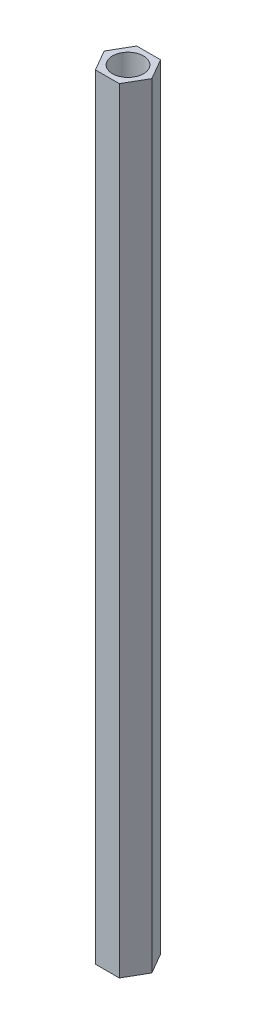
ISO-10303-21;
HEADER;
FILE_DESCRIPTION(('STEP AP214'),'2;1');
FILE_NAME('part.step','',(''),(''),'','','');
FILE_SCHEMA(('AUTOMOTIVE_DESIGN { 1 0 10303 214 1 1 1 1 }'));
ENDSEC;
DATA;
#1=APPLICATION_CONTEXT('core data for automotive mechanical design processes');
#2=APPLICATION_PROTOCOL_DEFINITION('international standard','automotive_design',2000,#1);
#3=PRODUCT_CONTEXT('',#1,'mechanical');
#4=PRODUCT('Part','Part','',(#3));
#5=PRODUCT_RELATED_PRODUCT_CATEGORY('part','',(#4));
#6=PRODUCT_DEFINITION_FORMATION('','',#4);
#7=PRODUCT_DEFINITION_CONTEXT('part definition',#1,'design');
#8=PRODUCT_DEFINITION('design','',#6,#7);
#9=PRODUCT_DEFINITION_SHAPE('','',#8);
#10=(LENGTH_UNIT() NAMED_UNIT(*) SI_UNIT(.MILLI.,.METRE.));
#11=(NAMED_UNIT(*) PLANE_ANGLE_UNIT() SI_UNIT($,.RADIAN.));
#12=(NAMED_UNIT(*) SI_UNIT($,.STERADIAN.) SOLID_ANGLE_UNIT());
#13=UNCERTAINTY_MEASURE_WITH_UNIT(LENGTH_MEASURE(1.E-05),#10,'distance_accuracy_value','');
#14=(GEOMETRIC_REPRESENTATION_CONTEXT(3) GLOBAL_UNCERTAINTY_ASSIGNED_CONTEXT((#13)) GLOBAL_UNIT_ASSIGNED_CONTEXT((#10,
#11,#12)) REPRESENTATION_CONTEXT('',''));
#15=CARTESIAN_POINT('',(0.,0.,0.));
#16=DIRECTION('',(0.,0.,1.));
#17=DIRECTION('',(1.,0.,0.));
#18=AXIS2_PLACEMENT_3D('',#15,#16,#17);
#19=CARTESIAN_POINT('',(1.15470053837925,75.,2.));
#20=DIRECTION('',(-0.866025403784439,0.,-0.5));
#21=DIRECTION('',(-0.5,0.,0.866025403784439));
#22=AXIS2_PLACEMENT_3D('',#19,#20,#21);
#23=PLANE('',#22);
#24=DIRECTION('',(0.5,0.,-0.866025403784439));
#25=VECTOR('',#24,1.);
#26=CARTESIAN_POINT('',(1.15470053837925,0.,2.));
#27=LINE('',#26,#25);
#28=CARTESIAN_POINT('',(1.15470053837925,0.,2.));
#29=VERTEX_POINT('',#28);
#30=CARTESIAN_POINT('',(2.3094010767585,0.,0.));
#31=VERTEX_POINT('',#30);
#32=EDGE_CURVE('E134',#29,#31,#27,.T.);
#33=ORIENTED_EDGE('',*,*,#32,.T.);
#34=DIRECTION('',(0.,-1.,0.));
#35=VECTOR('',#34,1.);
#36=CARTESIAN_POINT('',(2.3094010767585,75.,0.));
#37=LINE('',#36,#35);
#38=CARTESIAN_POINT('',(2.3094010767585,75.,0.));
#39=VERTEX_POINT('',#38);
#40=EDGE_CURVE('E11',#39,#31,#37,.T.);
#41=ORIENTED_EDGE('',*,*,#40,.F.);
#42=DIRECTION('',(0.5,0.,-0.866025403784439));
#43=VECTOR('',#42,1.);
#44=CARTESIAN_POINT('',(1.15470053837925,75.,2.));
#45=LINE('',#44,#43);
#46=CARTESIAN_POINT('',(1.15470053837925,75.,2.));
#47=VERTEX_POINT('',#46);
#48=EDGE_CURVE('E151',#47,#39,#45,.T.);
#49=ORIENTED_EDGE('',*,*,#48,.F.);
#50=DIRECTION('',(0.,-1.,0.));
#51=VECTOR('',#50,1.);
#52=CARTESIAN_POINT('',(1.15470053837925,75.,2.));
#53=LINE('',#52,#51);
#54=EDGE_CURVE('E130',#47,#29,#53,.T.);
#55=ORIENTED_EDGE('',*,*,#54,.T.);
#56=EDGE_LOOP('',(#33,#41,#49,#55));
#57=FACE_BOUND('',#56,.T.);
#58=ADVANCED_FACE('F45',(#57),#23,.F.);
#59=CARTESIAN_POINT('',(2.3094010767585,75.,0.));
#60=DIRECTION('',(-0.866025403784438,0.,0.5));
#61=DIRECTION('',(0.5,0.,0.866025403784439));
#62=AXIS2_PLACEMENT_3D('',#59,#60,#61);
#63=PLANE('',#62);
#64=DIRECTION('',(-0.5,0.,-0.866025403784438));
#65=VECTOR('',#64,1.);
#66=CARTESIAN_POINT('',(2.3094010767585,0.,0.));
#67=LINE('',#66,#65);
#68=CARTESIAN_POINT('',(1.15470053837925,0.,-2.));
#69=VERTEX_POINT('',#68);
#70=EDGE_CURVE('E138',#31,#69,#67,.T.);
#71=ORIENTED_EDGE('',*,*,#70,.T.);
#72=DIRECTION('',(0.,-1.,0.));
#73=VECTOR('',#72,1.);
#74=CARTESIAN_POINT('',(1.15470053837925,75.,-2.));
#75=LINE('',#74,#73);
#76=CARTESIAN_POINT('',(1.15470053837925,75.,-2.));
#77=VERTEX_POINT('',#76);
#78=EDGE_CURVE('E54',#77,#69,#75,.T.);
#79=ORIENTED_EDGE('',*,*,#78,.F.);
#80=DIRECTION('',(-0.5,0.,-0.866025403784438));
#81=VECTOR('',#80,1.);
#82=CARTESIAN_POINT('',(2.3094010767585,75.,0.));
#83=LINE('',#82,#81);
#84=EDGE_CURVE('E99',#39,#77,#83,.T.);
#85=ORIENTED_EDGE('',*,*,#84,.F.);
#86=ORIENTED_EDGE('',*,*,#40,.T.);
#87=EDGE_LOOP('',(#71,#79,#85,#86));
#88=FACE_BOUND('',#87,.T.);
#89=ADVANCED_FACE('F180',(#88),#63,.F.);
#90=CARTESIAN_POINT('',(1.15470053837925,75.,-2.));
#91=DIRECTION('',(0.,0.,1.));
#92=DIRECTION('',(1.,0.,0.));
#93=AXIS2_PLACEMENT_3D('',#90,#91,#92);
#94=PLANE('',#93);
#95=DIRECTION('',(-1.,0.,0.));
#96=VECTOR('',#95,1.);
#97=CARTESIAN_POINT('',(1.15470053837925,0.,-2.));
#98=LINE('',#97,#96);
#99=CARTESIAN_POINT('',(-1.15470053837925,0.,-2.));
#100=VERTEX_POINT('',#99);
#101=EDGE_CURVE('E142',#69,#100,#98,.T.);
#102=ORIENTED_EDGE('',*,*,#101,.T.);
#103=DIRECTION('',(0.,-1.,0.));
#104=VECTOR('',#103,1.);
#105=CARTESIAN_POINT('',(-1.15470053837925,75.,-2.));
#106=LINE('',#105,#104);
#107=CARTESIAN_POINT('',(-1.15470053837925,75.,-2.));
#108=VERTEX_POINT('',#107);
#109=EDGE_CURVE('E123',#108,#100,#106,.T.);
#110=ORIENTED_EDGE('',*,*,#109,.F.);
#111=DIRECTION('',(-1.,0.,0.));
#112=VECTOR('',#111,1.);
#113=CARTESIAN_POINT('',(1.15470053837925,75.,-2.));
#114=LINE('',#113,#112);
#115=EDGE_CURVE('E112',#77,#108,#114,.T.);
#116=ORIENTED_EDGE('',*,*,#115,.F.);
#117=ORIENTED_EDGE('',*,*,#78,.T.);
#118=EDGE_LOOP('',(#102,#110,#116,#117));
#119=FACE_BOUND('',#118,.T.);
#120=ADVANCED_FACE('F161',(#119),#94,.F.);
#121=CARTESIAN_POINT('',(-1.15470053837925,75.,-2.));
#122=DIRECTION('',(0.866025403784439,0.,0.5));
#123=DIRECTION('',(0.5,0.,-0.866025403784439));
#124=AXIS2_PLACEMENT_3D('',#121,#122,#123);
#125=PLANE('',#124);
#126=DIRECTION('',(-0.5,0.,0.866025403784439));
#127=VECTOR('',#126,1.);
#128=CARTESIAN_POINT('',(-1.15470053837925,0.,-2.));
#129=LINE('',#128,#127);
#130=CARTESIAN_POINT('',(-2.3094010767585,0.,0.));
#131=VERTEX_POINT('',#130);
#132=EDGE_CURVE('E121',#100,#131,#129,.T.);
#133=ORIENTED_EDGE('',*,*,#132,.T.);
#134=DIRECTION('',(0.,-1.,0.));
#135=VECTOR('',#134,1.);
#136=CARTESIAN_POINT('',(-2.3094010767585,75.,0.));
#137=LINE('',#136,#135);
#138=CARTESIAN_POINT('',(-2.3094010767585,75.,0.));
#139=VERTEX_POINT('',#138);
#140=EDGE_CURVE('E118',#139,#131,#137,.T.);
#141=ORIENTED_EDGE('',*,*,#140,.F.);
#142=DIRECTION('',(-0.5,0.,0.866025403784439));
#143=VECTOR('',#142,1.);
#144=CARTESIAN_POINT('',(-1.15470053837925,75.,-2.));
#145=LINE('',#144,#143);
#146=EDGE_CURVE('E106',#108,#139,#145,.T.);
#147=ORIENTED_EDGE('',*,*,#146,.F.);
#148=ORIENTED_EDGE('',*,*,#109,.T.);
#149=EDGE_LOOP('',(#133,#141,#147,#148));
#150=FACE_BOUND('',#149,.T.);
#151=ADVANCED_FACE('F119',(#150),#125,.F.);
#152=CARTESIAN_POINT('',(-2.3094010767585,75.,0.));
#153=DIRECTION('',(0.866025403784439,0.,-0.5));
#154=DIRECTION('',(-0.5,0.,-0.866025403784439));
#155=AXIS2_PLACEMENT_3D('',#152,#153,#154);
#156=PLANE('',#155);
#157=DIRECTION('',(0.5,0.,0.866025403784439));
#158=VECTOR('',#157,1.);
#159=CARTESIAN_POINT('',(-2.3094010767585,0.,0.));
#160=LINE('',#159,#158);
#161=CARTESIAN_POINT('',(-1.15470053837925,0.,2.));
#162=VERTEX_POINT('',#161);
#163=EDGE_CURVE('E85',#131,#162,#160,.T.);
#164=ORIENTED_EDGE('',*,*,#163,.T.);
#165=DIRECTION('',(0.,-1.,0.));
#166=VECTOR('',#165,1.);
#167=CARTESIAN_POINT('',(-1.15470053837925,75.,2.));
#168=LINE('',#167,#166);
#169=CARTESIAN_POINT('',(-1.15470053837925,75.,2.));
#170=VERTEX_POINT('',#169);
#171=EDGE_CURVE('E124',#170,#162,#168,.T.);
#172=ORIENTED_EDGE('',*,*,#171,.F.);
#173=DIRECTION('',(0.5,0.,0.866025403784439));
#174=VECTOR('',#173,1.);
#175=CARTESIAN_POINT('',(-2.3094010767585,75.,0.));
#176=LINE('',#175,#174);
#177=EDGE_CURVE('E110',#139,#170,#176,.T.);
#178=ORIENTED_EDGE('',*,*,#177,.F.);
#179=ORIENTED_EDGE('',*,*,#140,.T.);
#180=EDGE_LOOP('',(#164,#172,#178,#179));
#181=FACE_BOUND('',#180,.T.);
#182=ADVANCED_FACE('F126',(#181),#156,.F.);
#183=CARTESIAN_POINT('',(-1.15470053837925,75.,2.));
#184=DIRECTION('',(0.,0.,-1.));
#185=DIRECTION('',(-1.,0.,0.));
#186=AXIS2_PLACEMENT_3D('',#183,#184,#185);
#187=PLANE('',#186);
#188=DIRECTION('',(1.,0.,0.));
#189=VECTOR('',#188,1.);
#190=CARTESIAN_POINT('',(-1.15470053837925,0.,2.));
#191=LINE('',#190,#189);
#192=EDGE_CURVE('E91',#162,#29,#191,.T.);
#193=ORIENTED_EDGE('',*,*,#192,.T.);
#194=ORIENTED_EDGE('',*,*,#54,.F.);
#195=DIRECTION('',(1.,0.,0.));
#196=VECTOR('',#195,1.);
#197=CARTESIAN_POINT('',(-1.15470053837925,75.,2.));
#198=LINE('',#197,#196);
#199=EDGE_CURVE('E62',#170,#47,#198,.T.);
#200=ORIENTED_EDGE('',*,*,#199,.F.);
#201=ORIENTED_EDGE('',*,*,#171,.T.);
#202=EDGE_LOOP('',(#193,#194,#200,#201));
#203=FACE_BOUND('',#202,.T.);
#204=ADVANCED_FACE('F168',(#203),#187,.F.);
#205=CARTESIAN_POINT('',(0.,75.,0.));
#206=DIRECTION('',(0.,1.,0.));
#207=DIRECTION('',(0.,0.,1.));
#208=AXIS2_PLACEMENT_3D('',#205,#206,#207);
#209=PLANE('',#208);
#210=CARTESIAN_POINT('',(0.,75.,0.));
#211=DIRECTION('',(0.,1.,0.));
#212=DIRECTION('',(0.,0.,1.));
#213=AXIS2_PLACEMENT_3D('',#210,#211,#212);
#214=CIRCLE('',#213,1.5);
#215=CARTESIAN_POINT('',(0.,75.,1.5));
#216=VERTEX_POINT('',#215);
#217=EDGE_CURVE('E269',#216,#216,#214,.T.);
#218=ORIENTED_EDGE('',*,*,#217,.F.);
#219=EDGE_LOOP('',(#218));
#220=FACE_BOUND('',#219,.T.);
#221=ORIENTED_EDGE('',*,*,#48,.T.);
#222=ORIENTED_EDGE('',*,*,#84,.T.);
#223=ORIENTED_EDGE('',*,*,#115,.T.);
#224=ORIENTED_EDGE('',*,*,#146,.T.);
#225=ORIENTED_EDGE('',*,*,#177,.T.);
#226=ORIENTED_EDGE('',*,*,#199,.T.);
#227=EDGE_LOOP('',(#221,#222,#223,#224,#225,#226));
#228=FACE_BOUND('',#227,.T.);
#229=ADVANCED_FACE('F108',(#220,#228),#209,.T.);
#230=CARTESIAN_POINT('',(0.,0.,0.));
#231=DIRECTION('',(0.,1.,0.));
#232=DIRECTION('',(0.,0.,1.));
#233=AXIS2_PLACEMENT_3D('',#230,#231,#232);
#234=PLANE('',#233);
#235=CARTESIAN_POINT('',(0.,0.,0.));
#236=DIRECTION('',(0.,1.,0.));
#237=DIRECTION('',(0.,0.,1.));
#238=AXIS2_PLACEMENT_3D('',#235,#236,#237);
#239=CIRCLE('',#238,1.5);
#240=CARTESIAN_POINT('',(0.,0.,1.5));
#241=VERTEX_POINT('',#240);
#242=EDGE_CURVE('E139',#241,#241,#239,.T.);
#243=ORIENTED_EDGE('',*,*,#242,.T.);
#244=EDGE_LOOP('',(#243));
#245=FACE_BOUND('',#244,.T.);
#246=ORIENTED_EDGE('',*,*,#32,.F.);
#247=ORIENTED_EDGE('',*,*,#192,.F.);
#248=ORIENTED_EDGE('',*,*,#163,.F.);
#249=ORIENTED_EDGE('',*,*,#132,.F.);
#250=ORIENTED_EDGE('',*,*,#101,.F.);
#251=ORIENTED_EDGE('',*,*,#70,.F.);
#252=EDGE_LOOP('',(#246,#247,#248,#249,#250,#251));
#253=FACE_BOUND('',#252,.T.);
#254=ADVANCED_FACE('F164',(#245,#253),#234,.F.);
#255=CARTESIAN_POINT('',(0.,0.,0.));
#256=DIRECTION('',(0.,1.,0.));
#257=DIRECTION('',(0.,0.,1.));
#258=AXIS2_PLACEMENT_3D('',#255,#256,#257);
#259=CYLINDRICAL_SURFACE('',#258,1.5);
#260=ORIENTED_EDGE('',*,*,#242,.F.);
#261=EDGE_LOOP('',(#260));
#262=FACE_BOUND('',#261,.T.);
#263=ORIENTED_EDGE('',*,*,#217,.T.);
#264=EDGE_LOOP('',(#263));
#265=FACE_BOUND('',#264,.T.);
#266=ADVANCED_FACE('F222',(#262,#265),#259,.F.);
#267=CLOSED_SHELL('',(#58,#89,#120,#151,#182,#204,#229,#254,#266));
#268=MANIFOLD_SOLID_BREP('B2',#267);
#269=ADVANCED_BREP_SHAPE_REPRESENTATION('',(#18,#268),#14);
#270=SHAPE_DEFINITION_REPRESENTATION(#9,#269);
ENDSEC;
END-ISO-10303-21;
